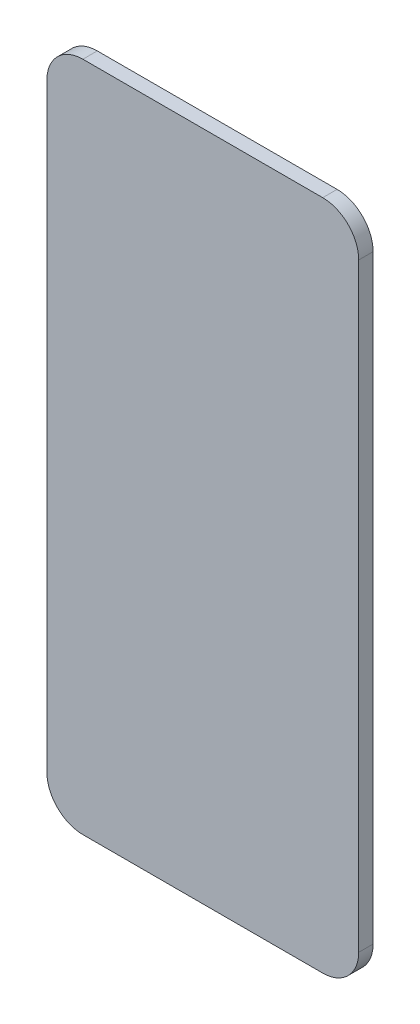
ISO-10303-21;
HEADER;
FILE_DESCRIPTION(('STEP AP214'),'2;1');
FILE_NAME('part.step','',(''),(''),'','','');
FILE_SCHEMA(('AUTOMOTIVE_DESIGN { 1 0 10303 214 1 1 1 1 }'));
ENDSEC;
DATA;
#1=APPLICATION_CONTEXT('core data for automotive mechanical design processes');
#2=APPLICATION_PROTOCOL_DEFINITION('international standard','automotive_design',2000,#1);
#3=PRODUCT_CONTEXT('',#1,'mechanical');
#4=PRODUCT('Part','Part','',(#3));
#5=PRODUCT_RELATED_PRODUCT_CATEGORY('part','',(#4));
#6=PRODUCT_DEFINITION_FORMATION('','',#4);
#7=PRODUCT_DEFINITION_CONTEXT('part definition',#1,'design');
#8=PRODUCT_DEFINITION('design','',#6,#7);
#9=PRODUCT_DEFINITION_SHAPE('','',#8);
#10=(LENGTH_UNIT() NAMED_UNIT(*) SI_UNIT(.MILLI.,.METRE.));
#11=(NAMED_UNIT(*) PLANE_ANGLE_UNIT() SI_UNIT($,.RADIAN.));
#12=(NAMED_UNIT(*) SI_UNIT($,.STERADIAN.) SOLID_ANGLE_UNIT());
#13=UNCERTAINTY_MEASURE_WITH_UNIT(LENGTH_MEASURE(1.E-05),#10,'distance_accuracy_value','');
#14=(GEOMETRIC_REPRESENTATION_CONTEXT(3) GLOBAL_UNCERTAINTY_ASSIGNED_CONTEXT((#13)) GLOBAL_UNIT_ASSIGNED_CONTEXT((#10,
#11,#12)) REPRESENTATION_CONTEXT('',''));
#15=CARTESIAN_POINT('',(0.,0.,0.));
#16=DIRECTION('',(0.,0.,1.));
#17=DIRECTION('',(1.,0.,0.));
#18=AXIS2_PLACEMENT_3D('',#15,#16,#17);
#19=CARTESIAN_POINT('',(-13.,-28.,1.2));
#20=DIRECTION('',(1.,0.,0.));
#21=DIRECTION('',(0.,0.,-1.));
#22=AXIS2_PLACEMENT_3D('',#19,#20,#21);
#23=PLANE('',#22);
#24=DIRECTION('',(0.,-1.,0.));
#25=VECTOR('',#24,1.);
#26=CARTESIAN_POINT('',(-13.,-28.,0.));
#27=LINE('',#26,#25);
#28=CARTESIAN_POINT('',(-13.,25.,0.));
#29=VERTEX_POINT('',#28);
#30=CARTESIAN_POINT('',(-13.,-25.,0.));
#31=VERTEX_POINT('',#30);
#32=EDGE_CURVE('E125',#29,#31,#27,.T.);
#33=ORIENTED_EDGE('',*,*,#32,.T.);
#34=DIRECTION('',(0.,0.,-1.));
#35=VECTOR('',#34,1.);
#36=CARTESIAN_POINT('',(-13.,-25.,1.2));
#37=LINE('',#36,#35);
#38=CARTESIAN_POINT('',(-13.,-25.,1.2));
#39=VERTEX_POINT('',#38);
#40=EDGE_CURVE('E103',#31,#39,#37,.F.);
#41=ORIENTED_EDGE('',*,*,#40,.T.);
#42=DIRECTION('',(0.,-1.,0.));
#43=VECTOR('',#42,1.);
#44=CARTESIAN_POINT('',(-13.,-28.,1.2));
#45=LINE('',#44,#43);
#46=CARTESIAN_POINT('',(-13.,25.,1.2));
#47=VERTEX_POINT('',#46);
#48=EDGE_CURVE('E134',#47,#39,#45,.T.);
#49=ORIENTED_EDGE('',*,*,#48,.F.);
#50=DIRECTION('',(0.,0.,-1.));
#51=VECTOR('',#50,1.);
#52=CARTESIAN_POINT('',(-13.,25.,1.2));
#53=LINE('',#52,#51);
#54=EDGE_CURVE('E108',#47,#29,#53,.T.);
#55=ORIENTED_EDGE('',*,*,#54,.T.);
#56=EDGE_LOOP('',(#33,#41,#49,#55));
#57=FACE_BOUND('',#56,.T.);
#58=ADVANCED_FACE('F33',(#57),#23,.F.);
#59=CARTESIAN_POINT('',(13.,-28.,1.2));
#60=DIRECTION('',(0.,1.,0.));
#61=DIRECTION('',(0.,0.,1.));
#62=AXIS2_PLACEMENT_3D('',#59,#60,#61);
#63=PLANE('',#62);
#64=DIRECTION('',(1.,0.,0.));
#65=VECTOR('',#64,1.);
#66=CARTESIAN_POINT('',(13.,-28.,1.2));
#67=LINE('',#66,#65);
#68=CARTESIAN_POINT('',(-9.99999999999999,-28.,1.2));
#69=VERTEX_POINT('',#68);
#70=CARTESIAN_POINT('',(10.,-28.,1.2));
#71=VERTEX_POINT('',#70);
#72=EDGE_CURVE('E118',#69,#71,#67,.T.);
#73=ORIENTED_EDGE('',*,*,#72,.F.);
#74=DIRECTION('',(0.,0.,-1.));
#75=VECTOR('',#74,1.);
#76=CARTESIAN_POINT('',(-10.,-28.,1.2));
#77=LINE('',#76,#75);
#78=CARTESIAN_POINT('',(-9.99999999999999,-28.,0.));
#79=VERTEX_POINT('',#78);
#80=EDGE_CURVE('E102',#69,#79,#77,.T.);
#81=ORIENTED_EDGE('',*,*,#80,.T.);
#82=DIRECTION('',(1.,0.,0.));
#83=VECTOR('',#82,1.);
#84=CARTESIAN_POINT('',(13.,-28.,0.));
#85=LINE('',#84,#83);
#86=CARTESIAN_POINT('',(10.,-28.,0.));
#87=VERTEX_POINT('',#86);
#88=EDGE_CURVE('E115',#79,#87,#85,.T.);
#89=ORIENTED_EDGE('',*,*,#88,.T.);
#90=DIRECTION('',(0.,0.,-1.));
#91=VECTOR('',#90,1.);
#92=CARTESIAN_POINT('',(10.,-28.,1.2));
#93=LINE('',#92,#91);
#94=EDGE_CURVE('E120',#87,#71,#93,.F.);
#95=ORIENTED_EDGE('',*,*,#94,.T.);
#96=EDGE_LOOP('',(#73,#81,#89,#95));
#97=FACE_BOUND('',#96,.T.);
#98=ADVANCED_FACE('F114',(#97),#63,.F.);
#99=CARTESIAN_POINT('',(13.,-28.,1.2));
#100=DIRECTION('',(-1.,0.,0.));
#101=DIRECTION('',(0.,0.,1.));
#102=AXIS2_PLACEMENT_3D('',#99,#100,#101);
#103=PLANE('',#102);
#104=DIRECTION('',(0.,1.,0.));
#105=VECTOR('',#104,1.);
#106=CARTESIAN_POINT('',(13.,-28.,1.2));
#107=LINE('',#106,#105);
#108=CARTESIAN_POINT('',(13.,-25.,1.2));
#109=VERTEX_POINT('',#108);
#110=CARTESIAN_POINT('',(13.,25.,1.2));
#111=VERTEX_POINT('',#110);
#112=EDGE_CURVE('E168',#109,#111,#107,.T.);
#113=ORIENTED_EDGE('',*,*,#112,.F.);
#114=DIRECTION('',(0.,0.,-1.));
#115=VECTOR('',#114,1.);
#116=CARTESIAN_POINT('',(13.,-25.,1.2));
#117=LINE('',#116,#115);
#118=CARTESIAN_POINT('',(13.,-25.,0.));
#119=VERTEX_POINT('',#118);
#120=EDGE_CURVE('E153',#109,#119,#117,.T.);
#121=ORIENTED_EDGE('',*,*,#120,.T.);
#122=DIRECTION('',(0.,1.,0.));
#123=VECTOR('',#122,1.);
#124=CARTESIAN_POINT('',(13.,-28.,0.));
#125=LINE('',#124,#123);
#126=CARTESIAN_POINT('',(13.,25.,0.));
#127=VERTEX_POINT('',#126);
#128=EDGE_CURVE('E124',#119,#127,#125,.T.);
#129=ORIENTED_EDGE('',*,*,#128,.T.);
#130=DIRECTION('',(0.,0.,-1.));
#131=VECTOR('',#130,1.);
#132=CARTESIAN_POINT('',(13.,25.,1.2));
#133=LINE('',#132,#131);
#134=EDGE_CURVE('E151',#127,#111,#133,.F.);
#135=ORIENTED_EDGE('',*,*,#134,.T.);
#136=EDGE_LOOP('',(#113,#121,#129,#135));
#137=FACE_BOUND('',#136,.T.);
#138=ADVANCED_FACE('F179',(#137),#103,.F.);
#139=CARTESIAN_POINT('',(13.,28.,1.2));
#140=DIRECTION('',(0.,-1.,0.));
#141=DIRECTION('',(0.,0.,-1.));
#142=AXIS2_PLACEMENT_3D('',#139,#140,#141);
#143=PLANE('',#142);
#144=DIRECTION('',(-1.,0.,0.));
#145=VECTOR('',#144,1.);
#146=CARTESIAN_POINT('',(13.,28.,0.));
#147=LINE('',#146,#145);
#148=CARTESIAN_POINT('',(10.,28.,0.));
#149=VERTEX_POINT('',#148);
#150=CARTESIAN_POINT('',(-9.99999999999999,28.,0.));
#151=VERTEX_POINT('',#150);
#152=EDGE_CURVE('E128',#149,#151,#147,.T.);
#153=ORIENTED_EDGE('',*,*,#152,.T.);
#154=DIRECTION('',(0.,0.,-1.));
#155=VECTOR('',#154,1.);
#156=CARTESIAN_POINT('',(-10.,28.,1.2));
#157=LINE('',#156,#155);
#158=CARTESIAN_POINT('',(-9.99999999999999,28.,1.2));
#159=VERTEX_POINT('',#158);
#160=EDGE_CURVE('E11',#151,#159,#157,.F.);
#161=ORIENTED_EDGE('',*,*,#160,.T.);
#162=DIRECTION('',(-1.,0.,0.));
#163=VECTOR('',#162,1.);
#164=CARTESIAN_POINT('',(13.,28.,1.2));
#165=LINE('',#164,#163);
#166=CARTESIAN_POINT('',(10.,28.,1.2));
#167=VERTEX_POINT('',#166);
#168=EDGE_CURVE('E135',#167,#159,#165,.T.);
#169=ORIENTED_EDGE('',*,*,#168,.F.);
#170=DIRECTION('',(0.,0.,-1.));
#171=VECTOR('',#170,1.);
#172=CARTESIAN_POINT('',(10.,28.,1.2));
#173=LINE('',#172,#171);
#174=EDGE_CURVE('E41',#167,#149,#173,.T.);
#175=ORIENTED_EDGE('',*,*,#174,.T.);
#176=EDGE_LOOP('',(#153,#161,#169,#175));
#177=FACE_BOUND('',#176,.T.);
#178=ADVANCED_FACE('F158',(#177),#143,.F.);
#179=CARTESIAN_POINT('',(0.,0.,1.2));
#180=DIRECTION('',(0.,0.,1.));
#181=DIRECTION('',(1.,0.,0.));
#182=AXIS2_PLACEMENT_3D('',#179,#180,#181);
#183=PLANE('',#182);
#184=ORIENTED_EDGE('',*,*,#48,.T.);
#185=CARTESIAN_POINT('',(-10.,-25.,1.2));
#186=DIRECTION('',(0.,0.,1.));
#187=DIRECTION('',(1.,0.,0.));
#188=AXIS2_PLACEMENT_3D('',#185,#186,#187);
#189=CIRCLE('',#188,3.);
#190=EDGE_CURVE('E149',#39,#69,#189,.T.);
#191=ORIENTED_EDGE('',*,*,#190,.T.);
#192=ORIENTED_EDGE('',*,*,#72,.T.);
#193=CARTESIAN_POINT('',(10.,-25.,1.2));
#194=DIRECTION('',(0.,0.,1.));
#195=DIRECTION('',(1.,0.,0.));
#196=AXIS2_PLACEMENT_3D('',#193,#194,#195);
#197=CIRCLE('',#196,3.);
#198=EDGE_CURVE('E147',#71,#109,#197,.T.);
#199=ORIENTED_EDGE('',*,*,#198,.T.);
#200=ORIENTED_EDGE('',*,*,#112,.T.);
#201=CARTESIAN_POINT('',(10.,25.,1.2));
#202=DIRECTION('',(0.,0.,1.));
#203=DIRECTION('',(1.,0.,0.));
#204=AXIS2_PLACEMENT_3D('',#201,#202,#203);
#205=CIRCLE('',#204,3.);
#206=EDGE_CURVE('E53',#111,#167,#205,.T.);
#207=ORIENTED_EDGE('',*,*,#206,.T.);
#208=ORIENTED_EDGE('',*,*,#168,.T.);
#209=CARTESIAN_POINT('',(-10.,25.,1.2));
#210=DIRECTION('',(0.,0.,1.));
#211=DIRECTION('',(1.,0.,0.));
#212=AXIS2_PLACEMENT_3D('',#209,#210,#211);
#213=CIRCLE('',#212,3.);
#214=EDGE_CURVE('E145',#159,#47,#213,.T.);
#215=ORIENTED_EDGE('',*,*,#214,.T.);
#216=EDGE_LOOP('',(#184,#191,#192,#199,#200,#207,#208,#215));
#217=FACE_BOUND('',#216,.T.);
#218=ADVANCED_FACE('F171',(#217),#183,.T.);
#219=CARTESIAN_POINT('',(0.,0.,0.));
#220=DIRECTION('',(0.,0.,1.));
#221=DIRECTION('',(1.,0.,0.));
#222=AXIS2_PLACEMENT_3D('',#219,#220,#221);
#223=PLANE('',#222);
#224=ORIENTED_EDGE('',*,*,#88,.F.);
#225=CARTESIAN_POINT('',(-10.,-25.,0.));
#226=DIRECTION('',(0.,0.,1.));
#227=DIRECTION('',(1.,0.,0.));
#228=AXIS2_PLACEMENT_3D('',#225,#226,#227);
#229=CIRCLE('',#228,3.);
#230=EDGE_CURVE('E98',#79,#31,#229,.F.);
#231=ORIENTED_EDGE('',*,*,#230,.T.);
#232=ORIENTED_EDGE('',*,*,#32,.F.);
#233=CARTESIAN_POINT('',(-10.,25.,0.));
#234=DIRECTION('',(0.,0.,1.));
#235=DIRECTION('',(1.,0.,0.));
#236=AXIS2_PLACEMENT_3D('',#233,#234,#235);
#237=CIRCLE('',#236,3.);
#238=EDGE_CURVE('E138',#29,#151,#237,.F.);
#239=ORIENTED_EDGE('',*,*,#238,.T.);
#240=ORIENTED_EDGE('',*,*,#152,.F.);
#241=CARTESIAN_POINT('',(10.,25.,0.));
#242=DIRECTION('',(0.,0.,1.));
#243=DIRECTION('',(1.,0.,0.));
#244=AXIS2_PLACEMENT_3D('',#241,#242,#243);
#245=CIRCLE('',#244,3.);
#246=EDGE_CURVE('E119',#149,#127,#245,.F.);
#247=ORIENTED_EDGE('',*,*,#246,.T.);
#248=ORIENTED_EDGE('',*,*,#128,.F.);
#249=CARTESIAN_POINT('',(10.,-25.,0.));
#250=DIRECTION('',(0.,0.,1.));
#251=DIRECTION('',(1.,0.,0.));
#252=AXIS2_PLACEMENT_3D('',#249,#250,#251);
#253=CIRCLE('',#252,3.);
#254=EDGE_CURVE('E109',#119,#87,#253,.F.);
#255=ORIENTED_EDGE('',*,*,#254,.T.);
#256=EDGE_LOOP('',(#224,#231,#232,#239,#240,#247,#248,#255));
#257=FACE_BOUND('',#256,.T.);
#258=ADVANCED_FACE('F122',(#257),#223,.F.);
#259=CARTESIAN_POINT('',(-10.,-25.,1.2));
#260=DIRECTION('',(0.,0.,-1.));
#261=DIRECTION('',(-1.,0.,0.));
#262=AXIS2_PLACEMENT_3D('',#259,#260,#261);
#263=CYLINDRICAL_SURFACE('',#262,3.);
#264=ORIENTED_EDGE('',*,*,#190,.F.);
#265=ORIENTED_EDGE('',*,*,#40,.F.);
#266=ORIENTED_EDGE('',*,*,#230,.F.);
#267=ORIENTED_EDGE('',*,*,#80,.F.);
#268=EDGE_LOOP('',(#264,#265,#266,#267));
#269=FACE_BOUND('',#268,.T.);
#270=ADVANCED_FACE('F101',(#269),#263,.T.);
#271=CARTESIAN_POINT('',(10.,-25.,1.2));
#272=DIRECTION('',(0.,0.,-1.));
#273=DIRECTION('',(-1.,0.,0.));
#274=AXIS2_PLACEMENT_3D('',#271,#272,#273);
#275=CYLINDRICAL_SURFACE('',#274,3.);
#276=ORIENTED_EDGE('',*,*,#198,.F.);
#277=ORIENTED_EDGE('',*,*,#94,.F.);
#278=ORIENTED_EDGE('',*,*,#254,.F.);
#279=ORIENTED_EDGE('',*,*,#120,.F.);
#280=EDGE_LOOP('',(#276,#277,#278,#279));
#281=FACE_BOUND('',#280,.T.);
#282=ADVANCED_FACE('F191',(#281),#275,.T.);
#283=CARTESIAN_POINT('',(-10.,25.,1.2));
#284=DIRECTION('',(0.,0.,-1.));
#285=DIRECTION('',(-1.,0.,0.));
#286=AXIS2_PLACEMENT_3D('',#283,#284,#285);
#287=CYLINDRICAL_SURFACE('',#286,3.);
#288=ORIENTED_EDGE('',*,*,#214,.F.);
#289=ORIENTED_EDGE('',*,*,#160,.F.);
#290=ORIENTED_EDGE('',*,*,#238,.F.);
#291=ORIENTED_EDGE('',*,*,#54,.F.);
#292=EDGE_LOOP('',(#288,#289,#290,#291));
#293=FACE_BOUND('',#292,.T.);
#294=ADVANCED_FACE('F163',(#293),#287,.T.);
#295=CARTESIAN_POINT('',(10.,25.,1.2));
#296=DIRECTION('',(0.,0.,-1.));
#297=DIRECTION('',(-1.,0.,0.));
#298=AXIS2_PLACEMENT_3D('',#295,#296,#297);
#299=CYLINDRICAL_SURFACE('',#298,3.);
#300=ORIENTED_EDGE('',*,*,#206,.F.);
#301=ORIENTED_EDGE('',*,*,#134,.F.);
#302=ORIENTED_EDGE('',*,*,#246,.F.);
#303=ORIENTED_EDGE('',*,*,#174,.F.);
#304=EDGE_LOOP('',(#300,#301,#302,#303));
#305=FACE_BOUND('',#304,.T.);
#306=ADVANCED_FACE('F35',(#305),#299,.T.);
#307=CLOSED_SHELL('',(#58,#98,#138,#178,#218,#258,#270,#282,#294,#306));
#308=MANIFOLD_SOLID_BREP('B2',#307);
#309=ADVANCED_BREP_SHAPE_REPRESENTATION('',(#18,#308),#14);
#310=SHAPE_DEFINITION_REPRESENTATION(#9,#309);
ENDSEC;
END-ISO-10303-21;
